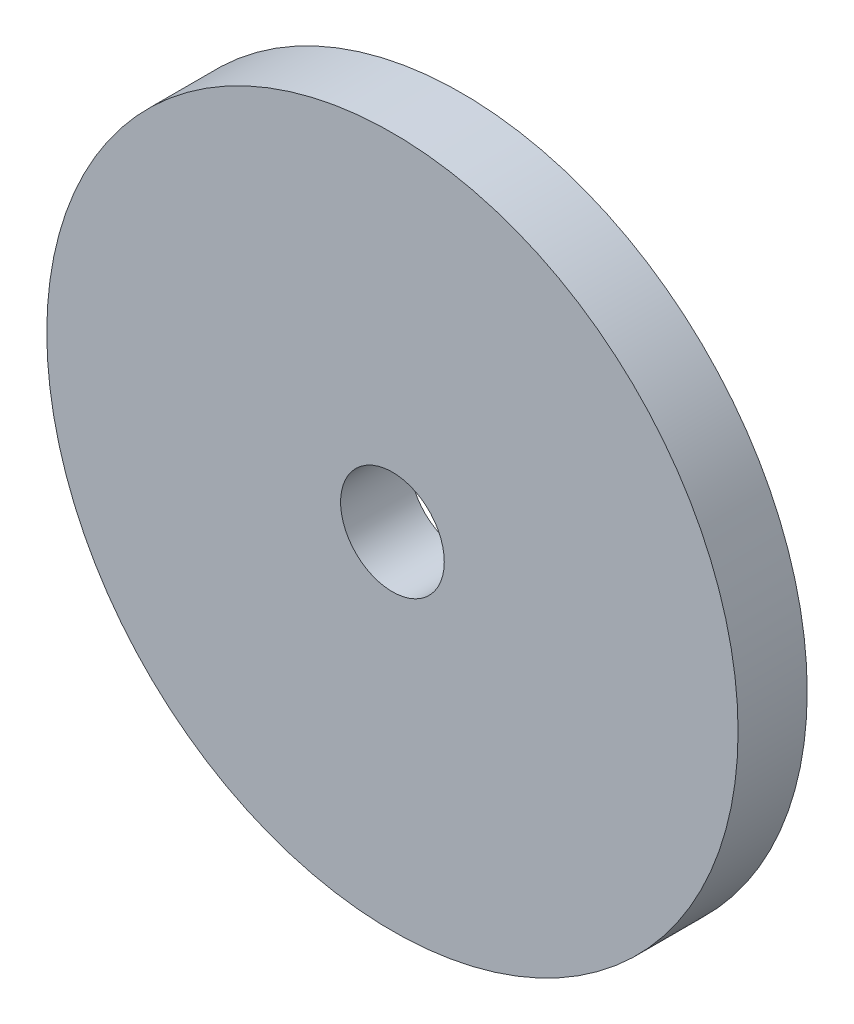
ISO-10303-21;
HEADER;
FILE_DESCRIPTION(('STEP AP214'),'2;1');
FILE_NAME('part.step','',(''),(''),'','','');
FILE_SCHEMA(('AUTOMOTIVE_DESIGN { 1 0 10303 214 1 1 1 1 }'));
ENDSEC;
DATA;
#1=APPLICATION_CONTEXT('core data for automotive mechanical design processes');
#2=APPLICATION_PROTOCOL_DEFINITION('international standard','automotive_design',2000,#1);
#3=PRODUCT_CONTEXT('',#1,'mechanical');
#4=PRODUCT('Part','Part','',(#3));
#5=PRODUCT_RELATED_PRODUCT_CATEGORY('part','',(#4));
#6=PRODUCT_DEFINITION_FORMATION('','',#4);
#7=PRODUCT_DEFINITION_CONTEXT('part definition',#1,'design');
#8=PRODUCT_DEFINITION('design','',#6,#7);
#9=PRODUCT_DEFINITION_SHAPE('','',#8);
#10=(LENGTH_UNIT() NAMED_UNIT(*) SI_UNIT(.MILLI.,.METRE.));
#11=(NAMED_UNIT(*) PLANE_ANGLE_UNIT() SI_UNIT($,.RADIAN.));
#12=(NAMED_UNIT(*) SI_UNIT($,.STERADIAN.) SOLID_ANGLE_UNIT());
#13=UNCERTAINTY_MEASURE_WITH_UNIT(LENGTH_MEASURE(1.E-05),#10,'distance_accuracy_value','');
#14=(GEOMETRIC_REPRESENTATION_CONTEXT(3) GLOBAL_UNCERTAINTY_ASSIGNED_CONTEXT((#13)) GLOBAL_UNIT_ASSIGNED_CONTEXT((#10,
#11,#12)) REPRESENTATION_CONTEXT('',''));
#15=CARTESIAN_POINT('',(0.,0.,0.));
#16=DIRECTION('',(0.,0.,1.));
#17=DIRECTION('',(1.,0.,0.));
#18=AXIS2_PLACEMENT_3D('',#15,#16,#17);
#19=CARTESIAN_POINT('',(0.,0.,2.));
#20=DIRECTION('',(0.,0.,1.));
#21=DIRECTION('',(1.,0.,0.));
#22=AXIS2_PLACEMENT_3D('',#19,#20,#21);
#23=PLANE('',#22);
#24=CARTESIAN_POINT('',(0.,0.,2.));
#25=DIRECTION('',(0.,0.,1.));
#26=DIRECTION('',(1.,0.,0.));
#27=AXIS2_PLACEMENT_3D('',#24,#25,#26);
#28=CIRCLE('',#27,10.0000000000077);
#29=CARTESIAN_POINT('',(10.0000000000077,0.,2.));
#30=VERTEX_POINT('',#29);
#31=EDGE_CURVE('E10',#30,#30,#28,.T.);
#32=ORIENTED_EDGE('',*,*,#31,.T.);
#33=EDGE_LOOP('',(#32));
#34=FACE_BOUND('',#33,.T.);
#35=CARTESIAN_POINT('',(0.,0.,2.));
#36=DIRECTION('',(0.,0.,1.));
#37=DIRECTION('',(1.,0.,0.));
#38=AXIS2_PLACEMENT_3D('',#35,#36,#37);
#39=CIRCLE('',#38,1.5);
#40=CARTESIAN_POINT('',(1.5,0.,2.));
#41=VERTEX_POINT('',#40);
#42=EDGE_CURVE('E42',#41,#41,#39,.T.);
#43=ORIENTED_EDGE('',*,*,#42,.F.);
#44=EDGE_LOOP('',(#43));
#45=FACE_BOUND('',#44,.T.);
#46=ADVANCED_FACE('F31',(#34,#45),#23,.T.);
#47=CARTESIAN_POINT('',(0.,0.,0.));
#48=DIRECTION('',(0.,0.,1.));
#49=DIRECTION('',(1.,0.,0.));
#50=AXIS2_PLACEMENT_3D('',#47,#48,#49);
#51=PLANE('',#50);
#52=CARTESIAN_POINT('',(0.,0.,0.));
#53=DIRECTION('',(0.,0.,1.));
#54=DIRECTION('',(1.,0.,0.));
#55=AXIS2_PLACEMENT_3D('',#52,#53,#54);
#56=CIRCLE('',#55,10.0000000000077);
#57=CARTESIAN_POINT('',(10.0000000000077,0.,0.));
#58=VERTEX_POINT('',#57);
#59=EDGE_CURVE('E35',#58,#58,#56,.T.);
#60=ORIENTED_EDGE('',*,*,#59,.F.);
#61=EDGE_LOOP('',(#60));
#62=FACE_BOUND('',#61,.T.);
#63=CARTESIAN_POINT('',(0.,0.,0.));
#64=DIRECTION('',(0.,0.,1.));
#65=DIRECTION('',(1.,0.,0.));
#66=AXIS2_PLACEMENT_3D('',#63,#64,#65);
#67=CIRCLE('',#66,1.5);
#68=CARTESIAN_POINT('',(1.5,0.,0.));
#69=VERTEX_POINT('',#68);
#70=EDGE_CURVE('E44',#69,#69,#67,.T.);
#71=ORIENTED_EDGE('',*,*,#70,.T.);
#72=EDGE_LOOP('',(#71));
#73=FACE_BOUND('',#72,.T.);
#74=ADVANCED_FACE('F54',(#62,#73),#51,.F.);
#75=CARTESIAN_POINT('',(0.,0.,2.));
#76=DIRECTION('',(0.,0.,-1.));
#77=DIRECTION('',(-1.,0.,0.));
#78=AXIS2_PLACEMENT_3D('',#75,#76,#77);
#79=CYLINDRICAL_SURFACE('',#78,10.0000000000077);
#80=ORIENTED_EDGE('',*,*,#31,.F.);
#81=EDGE_LOOP('',(#80));
#82=FACE_BOUND('',#81,.T.);
#83=ORIENTED_EDGE('',*,*,#59,.T.);
#84=EDGE_LOOP('',(#83));
#85=FACE_BOUND('',#84,.T.);
#86=ADVANCED_FACE('F33',(#82,#85),#79,.T.);
#87=CARTESIAN_POINT('',(0.,0.,2.));
#88=DIRECTION('',(0.,0.,-1.));
#89=DIRECTION('',(-1.,0.,0.));
#90=AXIS2_PLACEMENT_3D('',#87,#88,#89);
#91=CYLINDRICAL_SURFACE('',#90,1.5);
#92=ORIENTED_EDGE('',*,*,#42,.T.);
#93=EDGE_LOOP('',(#92));
#94=FACE_BOUND('',#93,.T.);
#95=ORIENTED_EDGE('',*,*,#70,.F.);
#96=EDGE_LOOP('',(#95));
#97=FACE_BOUND('',#96,.T.);
#98=ADVANCED_FACE('F50',(#94,#97),#91,.F.);
#99=CLOSED_SHELL('',(#46,#74,#86,#98));
#100=MANIFOLD_SOLID_BREP('B2',#99);
#101=ADVANCED_BREP_SHAPE_REPRESENTATION('',(#18,#100),#14);
#102=SHAPE_DEFINITION_REPRESENTATION(#9,#101);
ENDSEC;
END-ISO-10303-21;
